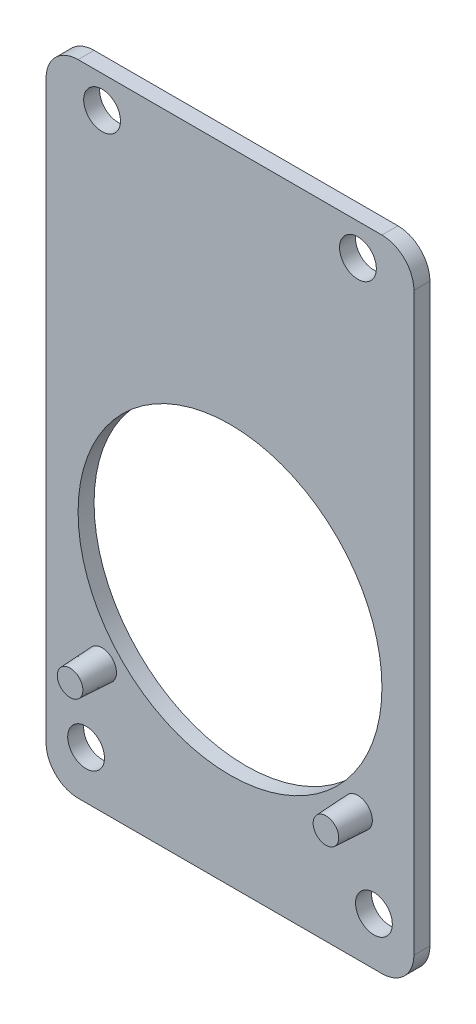
ISO-10303-21;
HEADER;
FILE_DESCRIPTION(('STEP AP214'),'2;1');
FILE_NAME('part.step','',(''),(''),'','','');
FILE_SCHEMA(('AUTOMOTIVE_DESIGN { 1 0 10303 214 1 1 1 1 }'));
ENDSEC;
DATA;
#1=APPLICATION_CONTEXT('core data for automotive mechanical design processes');
#2=APPLICATION_PROTOCOL_DEFINITION('international standard','automotive_design',2000,#1);
#3=PRODUCT_CONTEXT('',#1,'mechanical');
#4=PRODUCT('Part','Part','',(#3));
#5=PRODUCT_RELATED_PRODUCT_CATEGORY('part','',(#4));
#6=PRODUCT_DEFINITION_FORMATION('','',#4);
#7=PRODUCT_DEFINITION_CONTEXT('part definition',#1,'design');
#8=PRODUCT_DEFINITION('design','',#6,#7);
#9=PRODUCT_DEFINITION_SHAPE('','',#8);
#10=(LENGTH_UNIT() NAMED_UNIT(*) SI_UNIT(.MILLI.,.METRE.));
#11=(NAMED_UNIT(*) PLANE_ANGLE_UNIT() SI_UNIT($,.RADIAN.));
#12=(NAMED_UNIT(*) SI_UNIT($,.STERADIAN.) SOLID_ANGLE_UNIT());
#13=UNCERTAINTY_MEASURE_WITH_UNIT(LENGTH_MEASURE(1.E-05),#10,'distance_accuracy_value','');
#14=(GEOMETRIC_REPRESENTATION_CONTEXT(3) GLOBAL_UNCERTAINTY_ASSIGNED_CONTEXT((#13)) GLOBAL_UNIT_ASSIGNED_CONTEXT((#10,
#11,#12)) REPRESENTATION_CONTEXT('',''));
#15=CARTESIAN_POINT('',(0.,0.,0.));
#16=DIRECTION('',(0.,0.,1.));
#17=DIRECTION('',(1.,0.,0.));
#18=AXIS2_PLACEMENT_3D('',#15,#16,#17);
#19=CARTESIAN_POINT('',(0.,0.,1.));
#20=DIRECTION('',(0.,0.,-1.));
#21=DIRECTION('',(-1.,0.,0.));
#22=AXIS2_PLACEMENT_3D('',#19,#20,#21);
#23=PLANE('',#22);
#24=CARTESIAN_POINT('',(8.,-12.,1.));
#25=DIRECTION('',(0.,0.,-1.));
#26=DIRECTION('',(-1.,0.,0.));
#27=AXIS2_PLACEMENT_3D('',#24,#25,#26);
#28=CIRCLE('',#27,0.9);
#29=CARTESIAN_POINT('',(7.1,-12.,1.));
#30=VERTEX_POINT('',#29);
#31=EDGE_CURVE('E168',#30,#30,#28,.F.);
#32=ORIENTED_EDGE('',*,*,#31,.F.);
#33=EDGE_LOOP('',(#32));
#34=FACE_BOUND('',#33,.T.);
#35=CARTESIAN_POINT('',(-8.,-12.,1.));
#36=DIRECTION('',(0.,0.,-1.));
#37=DIRECTION('',(-1.,0.,0.));
#38=AXIS2_PLACEMENT_3D('',#35,#36,#37);
#39=CIRCLE('',#38,0.899999999999999);
#40=CARTESIAN_POINT('',(-8.9,-12.,1.));
#41=VERTEX_POINT('',#40);
#42=EDGE_CURVE('E165',#41,#41,#39,.F.);
#43=ORIENTED_EDGE('',*,*,#42,.F.);
#44=EDGE_LOOP('',(#43));
#45=FACE_BOUND('',#44,.T.);
#46=CARTESIAN_POINT('',(8.,18.,1.));
#47=DIRECTION('',(0.,0.,1.));
#48=DIRECTION('',(1.,0.,0.));
#49=AXIS2_PLACEMENT_3D('',#46,#47,#48);
#50=CIRCLE('',#49,1.15);
#51=CARTESIAN_POINT('',(9.15,18.,1.));
#52=VERTEX_POINT('',#51);
#53=EDGE_CURVE('E264',#52,#52,#50,.T.);
#54=ORIENTED_EDGE('',*,*,#53,.F.);
#55=EDGE_LOOP('',(#54));
#56=FACE_BOUND('',#55,.T.);
#57=CARTESIAN_POINT('',(-9.,-17.,1.));
#58=DIRECTION('',(0.,0.,1.));
#59=DIRECTION('',(1.,0.,0.));
#60=AXIS2_PLACEMENT_3D('',#57,#58,#59);
#61=CIRCLE('',#60,1.15);
#62=CARTESIAN_POINT('',(-7.85,-17.,1.));
#63=VERTEX_POINT('',#62);
#64=EDGE_CURVE('E257',#63,#63,#61,.T.);
#65=ORIENTED_EDGE('',*,*,#64,.F.);
#66=EDGE_LOOP('',(#65));
#67=FACE_BOUND('',#66,.T.);
#68=CARTESIAN_POINT('',(9.,-17.,1.));
#69=DIRECTION('',(0.,0.,1.));
#70=DIRECTION('',(1.,0.,0.));
#71=AXIS2_PLACEMENT_3D('',#68,#69,#70);
#72=CIRCLE('',#71,1.15);
#73=CARTESIAN_POINT('',(10.15,-17.,1.));
#74=VERTEX_POINT('',#73);
#75=EDGE_CURVE('E269',#74,#74,#72,.T.);
#76=ORIENTED_EDGE('',*,*,#75,.F.);
#77=EDGE_LOOP('',(#76));
#78=FACE_BOUND('',#77,.T.);
#79=CARTESIAN_POINT('',(-8.,18.,1.));
#80=DIRECTION('',(0.,0.,1.));
#81=DIRECTION('',(1.,0.,0.));
#82=AXIS2_PLACEMENT_3D('',#79,#80,#81);
#83=CIRCLE('',#82,1.15);
#84=CARTESIAN_POINT('',(-6.85,18.,1.));
#85=VERTEX_POINT('',#84);
#86=EDGE_CURVE('E251',#85,#85,#83,.T.);
#87=ORIENTED_EDGE('',*,*,#86,.F.);
#88=EDGE_LOOP('',(#87));
#89=FACE_BOUND('',#88,.T.);
#90=DIRECTION('',(0.,-1.,0.));
#91=VECTOR('',#90,1.);
#92=CARTESIAN_POINT('',(-11.5,-20.,1.));
#93=LINE('',#92,#91);
#94=CARTESIAN_POINT('',(-11.5,18.,1.));
#95=VERTEX_POINT('',#94);
#96=CARTESIAN_POINT('',(-11.5,-18.,1.));
#97=VERTEX_POINT('',#96);
#98=EDGE_CURVE('E241',#95,#97,#93,.T.);
#99=ORIENTED_EDGE('',*,*,#98,.T.);
#100=CARTESIAN_POINT('',(-9.5,-18.,1.));
#101=DIRECTION('',(0.,0.,-1.));
#102=DIRECTION('',(-1.,0.,0.));
#103=AXIS2_PLACEMENT_3D('',#100,#101,#102);
#104=CIRCLE('',#103,2.);
#105=CARTESIAN_POINT('',(-9.5,-20.,1.));
#106=VERTEX_POINT('',#105);
#107=EDGE_CURVE('E154',#97,#106,#104,.F.);
#108=ORIENTED_EDGE('',*,*,#107,.T.);
#109=DIRECTION('',(1.,0.,0.));
#110=VECTOR('',#109,1.);
#111=CARTESIAN_POINT('',(-11.5,-20.,1.));
#112=LINE('',#111,#110);
#113=CARTESIAN_POINT('',(9.5,-20.,1.));
#114=VERTEX_POINT('',#113);
#115=EDGE_CURVE('E125',#106,#114,#112,.T.);
#116=ORIENTED_EDGE('',*,*,#115,.T.);
#117=CARTESIAN_POINT('',(9.5,-18.,1.));
#118=DIRECTION('',(0.,0.,-1.));
#119=DIRECTION('',(-1.,0.,0.));
#120=AXIS2_PLACEMENT_3D('',#117,#118,#119);
#121=CIRCLE('',#120,2.);
#122=CARTESIAN_POINT('',(11.5,-18.,1.));
#123=VERTEX_POINT('',#122);
#124=EDGE_CURVE('E152',#114,#123,#121,.F.);
#125=ORIENTED_EDGE('',*,*,#124,.T.);
#126=DIRECTION('',(0.,1.,0.));
#127=VECTOR('',#126,1.);
#128=CARTESIAN_POINT('',(11.5,-20.,1.));
#129=LINE('',#128,#127);
#130=CARTESIAN_POINT('',(11.5,18.,1.));
#131=VERTEX_POINT('',#130);
#132=EDGE_CURVE('E132',#123,#131,#129,.T.);
#133=ORIENTED_EDGE('',*,*,#132,.T.);
#134=CARTESIAN_POINT('',(9.5,18.,1.));
#135=DIRECTION('',(0.,0.,-1.));
#136=DIRECTION('',(-1.,0.,0.));
#137=AXIS2_PLACEMENT_3D('',#134,#135,#136);
#138=CIRCLE('',#137,2.);
#139=CARTESIAN_POINT('',(9.5,20.,1.));
#140=VERTEX_POINT('',#139);
#141=EDGE_CURVE('E60',#131,#140,#138,.F.);
#142=ORIENTED_EDGE('',*,*,#141,.T.);
#143=DIRECTION('',(-1.,0.,0.));
#144=VECTOR('',#143,1.);
#145=CARTESIAN_POINT('',(-11.5,20.,1.));
#146=LINE('',#145,#144);
#147=CARTESIAN_POINT('',(-9.5,20.,1.));
#148=VERTEX_POINT('',#147);
#149=EDGE_CURVE('E135',#140,#148,#146,.T.);
#150=ORIENTED_EDGE('',*,*,#149,.T.);
#151=CARTESIAN_POINT('',(-9.5,18.,1.));
#152=DIRECTION('',(0.,0.,-1.));
#153=DIRECTION('',(-1.,0.,0.));
#154=AXIS2_PLACEMENT_3D('',#151,#152,#153);
#155=CIRCLE('',#154,2.);
#156=EDGE_CURVE('E150',#148,#95,#155,.F.);
#157=ORIENTED_EDGE('',*,*,#156,.T.);
#158=EDGE_LOOP('',(#99,#108,#116,#125,#133,#142,#150,#157));
#159=FACE_BOUND('',#158,.T.);
#160=CARTESIAN_POINT('',(0.,-4.5,1.));
#161=DIRECTION('',(0.,0.,1.));
#162=DIRECTION('',(1.,0.,0.));
#163=AXIS2_PLACEMENT_3D('',#160,#161,#162);
#164=CIRCLE('',#163,9.5);
#165=CARTESIAN_POINT('',(9.5,-4.5,1.));
#166=VERTEX_POINT('',#165);
#167=EDGE_CURVE('E237',#166,#166,#164,.T.);
#168=ORIENTED_EDGE('',*,*,#167,.F.);
#169=EDGE_LOOP('',(#168));
#170=FACE_BOUND('',#169,.T.);
#171=ADVANCED_FACE('F37',(#34,#45,#56,#67,#78,#89,#159,#170),#23,.F.);
#172=CARTESIAN_POINT('',(0.,0.,0.));
#173=DIRECTION('',(0.,0.,-1.));
#174=DIRECTION('',(-1.,0.,0.));
#175=AXIS2_PLACEMENT_3D('',#172,#173,#174);
#176=PLANE('',#175);
#177=CARTESIAN_POINT('',(8.,18.,0.));
#178=DIRECTION('',(0.,0.,1.));
#179=DIRECTION('',(1.,0.,0.));
#180=AXIS2_PLACEMENT_3D('',#177,#178,#179);
#181=CIRCLE('',#180,1.15);
#182=CARTESIAN_POINT('',(9.15,18.,0.));
#183=VERTEX_POINT('',#182);
#184=EDGE_CURVE('E254',#183,#183,#181,.T.);
#185=ORIENTED_EDGE('',*,*,#184,.T.);
#186=EDGE_LOOP('',(#185));
#187=FACE_BOUND('',#186,.T.);
#188=CARTESIAN_POINT('',(-9.,-17.,0.));
#189=DIRECTION('',(0.,0.,1.));
#190=DIRECTION('',(1.,0.,0.));
#191=AXIS2_PLACEMENT_3D('',#188,#189,#190);
#192=CIRCLE('',#191,1.15);
#193=CARTESIAN_POINT('',(-7.85,-17.,0.));
#194=VERTEX_POINT('',#193);
#195=EDGE_CURVE('E260',#194,#194,#192,.T.);
#196=ORIENTED_EDGE('',*,*,#195,.T.);
#197=EDGE_LOOP('',(#196));
#198=FACE_BOUND('',#197,.T.);
#199=CARTESIAN_POINT('',(9.,-17.,0.));
#200=DIRECTION('',(0.,0.,1.));
#201=DIRECTION('',(1.,0.,0.));
#202=AXIS2_PLACEMENT_3D('',#199,#200,#201);
#203=CIRCLE('',#202,1.15);
#204=CARTESIAN_POINT('',(10.15,-17.,0.));
#205=VERTEX_POINT('',#204);
#206=EDGE_CURVE('E261',#205,#205,#203,.T.);
#207=ORIENTED_EDGE('',*,*,#206,.T.);
#208=EDGE_LOOP('',(#207));
#209=FACE_BOUND('',#208,.T.);
#210=CARTESIAN_POINT('',(-8.,18.,0.));
#211=DIRECTION('',(0.,0.,1.));
#212=DIRECTION('',(1.,0.,0.));
#213=AXIS2_PLACEMENT_3D('',#210,#211,#212);
#214=CIRCLE('',#213,1.15);
#215=CARTESIAN_POINT('',(-6.85,18.,0.));
#216=VERTEX_POINT('',#215);
#217=EDGE_CURVE('E248',#216,#216,#214,.T.);
#218=ORIENTED_EDGE('',*,*,#217,.T.);
#219=EDGE_LOOP('',(#218));
#220=FACE_BOUND('',#219,.T.);
#221=DIRECTION('',(1.,0.,0.));
#222=VECTOR('',#221,1.);
#223=CARTESIAN_POINT('',(-11.5,-20.,0.));
#224=LINE('',#223,#222);
#225=CARTESIAN_POINT('',(-9.5,-20.,0.));
#226=VERTEX_POINT('',#225);
#227=CARTESIAN_POINT('',(9.5,-20.,0.));
#228=VERTEX_POINT('',#227);
#229=EDGE_CURVE('E122',#226,#228,#224,.T.);
#230=ORIENTED_EDGE('',*,*,#229,.F.);
#231=CARTESIAN_POINT('',(-9.5,-18.,0.));
#232=DIRECTION('',(0.,0.,-1.));
#233=DIRECTION('',(-1.,0.,0.));
#234=AXIS2_PLACEMENT_3D('',#231,#232,#233);
#235=CIRCLE('',#234,2.);
#236=CARTESIAN_POINT('',(-11.5,-18.,0.));
#237=VERTEX_POINT('',#236);
#238=EDGE_CURVE('E105',#226,#237,#235,.T.);
#239=ORIENTED_EDGE('',*,*,#238,.T.);
#240=DIRECTION('',(0.,-1.,0.));
#241=VECTOR('',#240,1.);
#242=CARTESIAN_POINT('',(-11.5,-20.,0.));
#243=LINE('',#242,#241);
#244=CARTESIAN_POINT('',(-11.5,18.,0.));
#245=VERTEX_POINT('',#244);
#246=EDGE_CURVE('E133',#245,#237,#243,.T.);
#247=ORIENTED_EDGE('',*,*,#246,.F.);
#248=CARTESIAN_POINT('',(-9.5,18.,0.));
#249=DIRECTION('',(0.,0.,-1.));
#250=DIRECTION('',(-1.,0.,0.));
#251=AXIS2_PLACEMENT_3D('',#248,#249,#250);
#252=CIRCLE('',#251,2.);
#253=CARTESIAN_POINT('',(-9.5,20.,0.));
#254=VERTEX_POINT('',#253);
#255=EDGE_CURVE('E143',#245,#254,#252,.T.);
#256=ORIENTED_EDGE('',*,*,#255,.T.);
#257=DIRECTION('',(-1.,0.,0.));
#258=VECTOR('',#257,1.);
#259=CARTESIAN_POINT('',(-11.5,20.,0.));
#260=LINE('',#259,#258);
#261=CARTESIAN_POINT('',(9.5,20.,0.));
#262=VERTEX_POINT('',#261);
#263=EDGE_CURVE('E137',#262,#254,#260,.T.);
#264=ORIENTED_EDGE('',*,*,#263,.F.);
#265=CARTESIAN_POINT('',(9.5,18.,0.));
#266=DIRECTION('',(0.,0.,-1.));
#267=DIRECTION('',(-1.,0.,0.));
#268=AXIS2_PLACEMENT_3D('',#265,#266,#267);
#269=CIRCLE('',#268,2.);
#270=CARTESIAN_POINT('',(11.5,18.,0.));
#271=VERTEX_POINT('',#270);
#272=EDGE_CURVE('E126',#262,#271,#269,.T.);
#273=ORIENTED_EDGE('',*,*,#272,.T.);
#274=DIRECTION('',(0.,1.,0.));
#275=VECTOR('',#274,1.);
#276=CARTESIAN_POINT('',(11.5,-20.,0.));
#277=LINE('',#276,#275);
#278=CARTESIAN_POINT('',(11.5,-18.,0.));
#279=VERTEX_POINT('',#278);
#280=EDGE_CURVE('E236',#279,#271,#277,.T.);
#281=ORIENTED_EDGE('',*,*,#280,.F.);
#282=CARTESIAN_POINT('',(9.5,-18.,0.));
#283=DIRECTION('',(0.,0.,-1.));
#284=DIRECTION('',(-1.,0.,0.));
#285=AXIS2_PLACEMENT_3D('',#282,#283,#284);
#286=CIRCLE('',#285,2.);
#287=EDGE_CURVE('E116',#279,#228,#286,.T.);
#288=ORIENTED_EDGE('',*,*,#287,.T.);
#289=EDGE_LOOP('',(#230,#239,#247,#256,#264,#273,#281,#288));
#290=FACE_BOUND('',#289,.T.);
#291=CARTESIAN_POINT('',(0.,-4.5,0.));
#292=DIRECTION('',(0.,0.,1.));
#293=DIRECTION('',(1.,0.,0.));
#294=AXIS2_PLACEMENT_3D('',#291,#292,#293);
#295=CIRCLE('',#294,9.5);
#296=CARTESIAN_POINT('',(9.5,-4.5,0.));
#297=VERTEX_POINT('',#296);
#298=EDGE_CURVE('E245',#297,#297,#295,.T.);
#299=ORIENTED_EDGE('',*,*,#298,.T.);
#300=EDGE_LOOP('',(#299));
#301=FACE_BOUND('',#300,.T.);
#302=ADVANCED_FACE('F129',(#187,#198,#209,#220,#290,#301),#176,.T.);
#303=CARTESIAN_POINT('',(11.5,-20.,1.));
#304=DIRECTION('',(-1.,0.,0.));
#305=DIRECTION('',(0.,0.,1.));
#306=AXIS2_PLACEMENT_3D('',#303,#304,#305);
#307=PLANE('',#306);
#308=ORIENTED_EDGE('',*,*,#132,.F.);
#309=DIRECTION('',(0.,0.,-1.));
#310=VECTOR('',#309,1.);
#311=CARTESIAN_POINT('',(11.5,-18.,1.));
#312=LINE('',#311,#310);
#313=EDGE_CURVE('E158',#123,#279,#312,.T.);
#314=ORIENTED_EDGE('',*,*,#313,.T.);
#315=ORIENTED_EDGE('',*,*,#280,.T.);
#316=DIRECTION('',(0.,0.,-1.));
#317=VECTOR('',#316,1.);
#318=CARTESIAN_POINT('',(11.5,18.,1.));
#319=LINE('',#318,#317);
#320=EDGE_CURVE('E156',#271,#131,#319,.F.);
#321=ORIENTED_EDGE('',*,*,#320,.T.);
#322=EDGE_LOOP('',(#308,#314,#315,#321));
#323=FACE_BOUND('',#322,.T.);
#324=ADVANCED_FACE('F193',(#323),#307,.F.);
#325=CARTESIAN_POINT('',(-11.5,20.,1.));
#326=DIRECTION('',(0.,-1.,0.));
#327=DIRECTION('',(0.,0.,-1.));
#328=AXIS2_PLACEMENT_3D('',#325,#326,#327);
#329=PLANE('',#328);
#330=ORIENTED_EDGE('',*,*,#263,.T.);
#331=DIRECTION('',(0.,0.,-1.));
#332=VECTOR('',#331,1.);
#333=CARTESIAN_POINT('',(-9.5,20.,1.));
#334=LINE('',#333,#332);
#335=EDGE_CURVE('E53',#254,#148,#334,.F.);
#336=ORIENTED_EDGE('',*,*,#335,.T.);
#337=ORIENTED_EDGE('',*,*,#149,.F.);
#338=DIRECTION('',(0.,0.,-1.));
#339=VECTOR('',#338,1.);
#340=CARTESIAN_POINT('',(9.5,20.,1.));
#341=LINE('',#340,#339);
#342=EDGE_CURVE('E161',#140,#262,#341,.T.);
#343=ORIENTED_EDGE('',*,*,#342,.T.);
#344=EDGE_LOOP('',(#330,#336,#337,#343));
#345=FACE_BOUND('',#344,.T.);
#346=ADVANCED_FACE('F207',(#345),#329,.F.);
#347=CARTESIAN_POINT('',(-11.5,-20.,1.));
#348=DIRECTION('',(1.,0.,0.));
#349=DIRECTION('',(0.,0.,-1.));
#350=AXIS2_PLACEMENT_3D('',#347,#348,#349);
#351=PLANE('',#350);
#352=ORIENTED_EDGE('',*,*,#246,.T.);
#353=DIRECTION('',(0.,0.,-1.));
#354=VECTOR('',#353,1.);
#355=CARTESIAN_POINT('',(-11.5,-18.,1.));
#356=LINE('',#355,#354);
#357=EDGE_CURVE('E110',#237,#97,#356,.F.);
#358=ORIENTED_EDGE('',*,*,#357,.T.);
#359=ORIENTED_EDGE('',*,*,#98,.F.);
#360=DIRECTION('',(0.,0.,-1.));
#361=VECTOR('',#360,1.);
#362=CARTESIAN_POINT('',(-11.5,18.,1.));
#363=LINE('',#362,#361);
#364=EDGE_CURVE('E115',#95,#245,#363,.T.);
#365=ORIENTED_EDGE('',*,*,#364,.T.);
#366=EDGE_LOOP('',(#352,#358,#359,#365));
#367=FACE_BOUND('',#366,.T.);
#368=ADVANCED_FACE('F204',(#367),#351,.F.);
#369=CARTESIAN_POINT('',(-11.5,-20.,1.));
#370=DIRECTION('',(0.,1.,0.));
#371=DIRECTION('',(0.,0.,1.));
#372=AXIS2_PLACEMENT_3D('',#369,#370,#371);
#373=PLANE('',#372);
#374=ORIENTED_EDGE('',*,*,#115,.F.);
#375=DIRECTION('',(0.,0.,-1.));
#376=VECTOR('',#375,1.);
#377=CARTESIAN_POINT('',(-9.5,-20.,1.));
#378=LINE('',#377,#376);
#379=EDGE_CURVE('E109',#106,#226,#378,.T.);
#380=ORIENTED_EDGE('',*,*,#379,.T.);
#381=ORIENTED_EDGE('',*,*,#229,.T.);
#382=DIRECTION('',(0.,0.,-1.));
#383=VECTOR('',#382,1.);
#384=CARTESIAN_POINT('',(9.5,-20.,1.));
#385=LINE('',#384,#383);
#386=EDGE_CURVE('E127',#228,#114,#385,.F.);
#387=ORIENTED_EDGE('',*,*,#386,.T.);
#388=EDGE_LOOP('',(#374,#380,#381,#387));
#389=FACE_BOUND('',#388,.T.);
#390=ADVANCED_FACE('F121',(#389),#373,.F.);
#391=CARTESIAN_POINT('',(0.,-4.5,1.));
#392=DIRECTION('',(0.,0.,-1.));
#393=DIRECTION('',(-1.,0.,0.));
#394=AXIS2_PLACEMENT_3D('',#391,#392,#393);
#395=CYLINDRICAL_SURFACE('',#394,9.5);
#396=ORIENTED_EDGE('',*,*,#167,.T.);
#397=EDGE_LOOP('',(#396));
#398=FACE_BOUND('',#397,.T.);
#399=ORIENTED_EDGE('',*,*,#298,.F.);
#400=EDGE_LOOP('',(#399));
#401=FACE_BOUND('',#400,.T.);
#402=ADVANCED_FACE('F199',(#398,#401),#395,.F.);
#403=CARTESIAN_POINT('',(-9.5,-18.,1.));
#404=DIRECTION('',(0.,0.,-1.));
#405=DIRECTION('',(-1.,0.,0.));
#406=AXIS2_PLACEMENT_3D('',#403,#404,#405);
#407=CYLINDRICAL_SURFACE('',#406,2.);
#408=ORIENTED_EDGE('',*,*,#107,.F.);
#409=ORIENTED_EDGE('',*,*,#357,.F.);
#410=ORIENTED_EDGE('',*,*,#238,.F.);
#411=ORIENTED_EDGE('',*,*,#379,.F.);
#412=EDGE_LOOP('',(#408,#409,#410,#411));
#413=FACE_BOUND('',#412,.T.);
#414=ADVANCED_FACE('F108',(#413),#407,.T.);
#415=CARTESIAN_POINT('',(9.5,-18.,1.));
#416=DIRECTION('',(0.,0.,-1.));
#417=DIRECTION('',(-1.,0.,0.));
#418=AXIS2_PLACEMENT_3D('',#415,#416,#417);
#419=CYLINDRICAL_SURFACE('',#418,2.);
#420=ORIENTED_EDGE('',*,*,#124,.F.);
#421=ORIENTED_EDGE('',*,*,#386,.F.);
#422=ORIENTED_EDGE('',*,*,#287,.F.);
#423=ORIENTED_EDGE('',*,*,#313,.F.);
#424=EDGE_LOOP('',(#420,#421,#422,#423));
#425=FACE_BOUND('',#424,.T.);
#426=ADVANCED_FACE('F216',(#425),#419,.T.);
#427=CARTESIAN_POINT('',(-9.5,18.,1.));
#428=DIRECTION('',(0.,0.,-1.));
#429=DIRECTION('',(-1.,0.,0.));
#430=AXIS2_PLACEMENT_3D('',#427,#428,#429);
#431=CYLINDRICAL_SURFACE('',#430,2.);
#432=ORIENTED_EDGE('',*,*,#156,.F.);
#433=ORIENTED_EDGE('',*,*,#335,.F.);
#434=ORIENTED_EDGE('',*,*,#255,.F.);
#435=ORIENTED_EDGE('',*,*,#364,.F.);
#436=EDGE_LOOP('',(#432,#433,#434,#435));
#437=FACE_BOUND('',#436,.T.);
#438=ADVANCED_FACE('F219',(#437),#431,.T.);
#439=CARTESIAN_POINT('',(9.5,18.,1.));
#440=DIRECTION('',(0.,0.,-1.));
#441=DIRECTION('',(-1.,0.,0.));
#442=AXIS2_PLACEMENT_3D('',#439,#440,#441);
#443=CYLINDRICAL_SURFACE('',#442,2.);
#444=ORIENTED_EDGE('',*,*,#141,.F.);
#445=ORIENTED_EDGE('',*,*,#320,.F.);
#446=ORIENTED_EDGE('',*,*,#272,.F.);
#447=ORIENTED_EDGE('',*,*,#342,.F.);
#448=EDGE_LOOP('',(#444,#445,#446,#447));
#449=FACE_BOUND('',#448,.T.);
#450=ADVANCED_FACE('F222',(#449),#443,.T.);
#451=CARTESIAN_POINT('',(-8.,18.,0.));
#452=DIRECTION('',(0.,0.,1.));
#453=DIRECTION('',(1.,0.,0.));
#454=AXIS2_PLACEMENT_3D('',#451,#452,#453);
#455=CYLINDRICAL_SURFACE('',#454,1.15);
#456=ORIENTED_EDGE('',*,*,#217,.F.);
#457=EDGE_LOOP('',(#456));
#458=FACE_BOUND('',#457,.T.);
#459=ORIENTED_EDGE('',*,*,#86,.T.);
#460=EDGE_LOOP('',(#459));
#461=FACE_BOUND('',#460,.T.);
#462=ADVANCED_FACE('F225',(#458,#461),#455,.F.);
#463=CARTESIAN_POINT('',(9.,-17.,0.));
#464=DIRECTION('',(0.,0.,1.));
#465=DIRECTION('',(1.,0.,0.));
#466=AXIS2_PLACEMENT_3D('',#463,#464,#465);
#467=CYLINDRICAL_SURFACE('',#466,1.15);
#468=ORIENTED_EDGE('',*,*,#206,.F.);
#469=EDGE_LOOP('',(#468));
#470=FACE_BOUND('',#469,.T.);
#471=ORIENTED_EDGE('',*,*,#75,.T.);
#472=EDGE_LOOP('',(#471));
#473=FACE_BOUND('',#472,.T.);
#474=ADVANCED_FACE('F230',(#470,#473),#467,.F.);
#475=CARTESIAN_POINT('',(-9.,-17.,0.));
#476=DIRECTION('',(0.,0.,1.));
#477=DIRECTION('',(1.,0.,0.));
#478=AXIS2_PLACEMENT_3D('',#475,#476,#477);
#479=CYLINDRICAL_SURFACE('',#478,1.15);
#480=ORIENTED_EDGE('',*,*,#195,.F.);
#481=EDGE_LOOP('',(#480));
#482=FACE_BOUND('',#481,.T.);
#483=ORIENTED_EDGE('',*,*,#64,.T.);
#484=EDGE_LOOP('',(#483));
#485=FACE_BOUND('',#484,.T.);
#486=ADVANCED_FACE('F279',(#482,#485),#479,.F.);
#487=CARTESIAN_POINT('',(8.,18.,0.));
#488=DIRECTION('',(0.,0.,1.));
#489=DIRECTION('',(1.,0.,0.));
#490=AXIS2_PLACEMENT_3D('',#487,#488,#489);
#491=CYLINDRICAL_SURFACE('',#490,1.15);
#492=ORIENTED_EDGE('',*,*,#184,.F.);
#493=EDGE_LOOP('',(#492));
#494=FACE_BOUND('',#493,.T.);
#495=ORIENTED_EDGE('',*,*,#53,.T.);
#496=EDGE_LOOP('',(#495));
#497=FACE_BOUND('',#496,.T.);
#498=ADVANCED_FACE('F342',(#494,#497),#491,.F.);
#499=CARTESIAN_POINT('',(-8.,-12.,3.));
#500=DIRECTION('',(0.,0.,1.));
#501=DIRECTION('',(1.,0.,0.));
#502=AXIS2_PLACEMENT_3D('',#499,#500,#501);
#503=PLANE('',#502);
#504=CARTESIAN_POINT('',(-8.,-12.,3.));
#505=DIRECTION('',(0.,0.,1.));
#506=DIRECTION('',(1.,0.,0.));
#507=AXIS2_PLACEMENT_3D('',#504,#505,#506);
#508=CIRCLE('',#507,0.799999999999936);
#509=CARTESIAN_POINT('',(-7.20000000000006,-12.,3.));
#510=VERTEX_POINT('',#509);
#511=EDGE_CURVE('E11',#510,#510,#508,.T.);
#512=ORIENTED_EDGE('',*,*,#511,.T.);
#513=EDGE_LOOP('',(#512));
#514=FACE_BOUND('',#513,.T.);
#515=ADVANCED_FACE('F183',(#514),#503,.T.);
#516=CARTESIAN_POINT('',(8.,-12.,3.));
#517=DIRECTION('',(0.,0.,1.));
#518=DIRECTION('',(1.,0.,0.));
#519=AXIS2_PLACEMENT_3D('',#516,#517,#518);
#520=PLANE('',#519);
#521=CARTESIAN_POINT('',(8.,-12.,3.));
#522=DIRECTION('',(0.,0.,1.));
#523=DIRECTION('',(1.,0.,0.));
#524=AXIS2_PLACEMENT_3D('',#521,#522,#523);
#525=CIRCLE('',#524,0.800000000000028);
#526=CARTESIAN_POINT('',(8.80000000000003,-12.,3.));
#527=VERTEX_POINT('',#526);
#528=EDGE_CURVE('E46',#527,#527,#525,.T.);
#529=ORIENTED_EDGE('',*,*,#528,.T.);
#530=EDGE_LOOP('',(#529));
#531=FACE_BOUND('',#530,.T.);
#532=ADVANCED_FACE('F173',(#531),#520,.T.);
#533=CARTESIAN_POINT('',(8.,-12.,3.));
#534=DIRECTION('',(0.,0.,-1.));
#535=DIRECTION('',(-1.,0.,0.));
#536=AXIS2_PLACEMENT_3D('',#533,#534,#535);
#537=CONICAL_SURFACE('',#536,0.800000000000028,0.0499583957219393);
#538=ORIENTED_EDGE('',*,*,#31,.T.);
#539=EDGE_LOOP('',(#538));
#540=FACE_BOUND('',#539,.T.);
#541=ORIENTED_EDGE('',*,*,#528,.F.);
#542=EDGE_LOOP('',(#541));
#543=FACE_BOUND('',#542,.T.);
#544=ADVANCED_FACE('F175',(#540,#543),#537,.T.);
#545=CARTESIAN_POINT('',(-8.,-12.,3.));
#546=DIRECTION('',(0.,0.,-1.));
#547=DIRECTION('',(-1.,0.,0.));
#548=AXIS2_PLACEMENT_3D('',#545,#546,#547);
#549=CONICAL_SURFACE('',#548,0.799999999999936,0.0499583957219388);
#550=ORIENTED_EDGE('',*,*,#42,.T.);
#551=EDGE_LOOP('',(#550));
#552=FACE_BOUND('',#551,.T.);
#553=ORIENTED_EDGE('',*,*,#511,.F.);
#554=EDGE_LOOP('',(#553));
#555=FACE_BOUND('',#554,.T.);
#556=ADVANCED_FACE('F40',(#552,#555),#549,.T.);
#557=CLOSED_SHELL('',(#171,#302,#324,#346,#368,#390,#402,#414,#426,#438,#450,#462,#474,#486,
#498,#515,#532,#544,#556));
#558=MANIFOLD_SOLID_BREP('B2',#557);
#559=ADVANCED_BREP_SHAPE_REPRESENTATION('',(#18,#558),#14);
#560=SHAPE_DEFINITION_REPRESENTATION(#9,#559);
ENDSEC;
END-ISO-10303-21;
